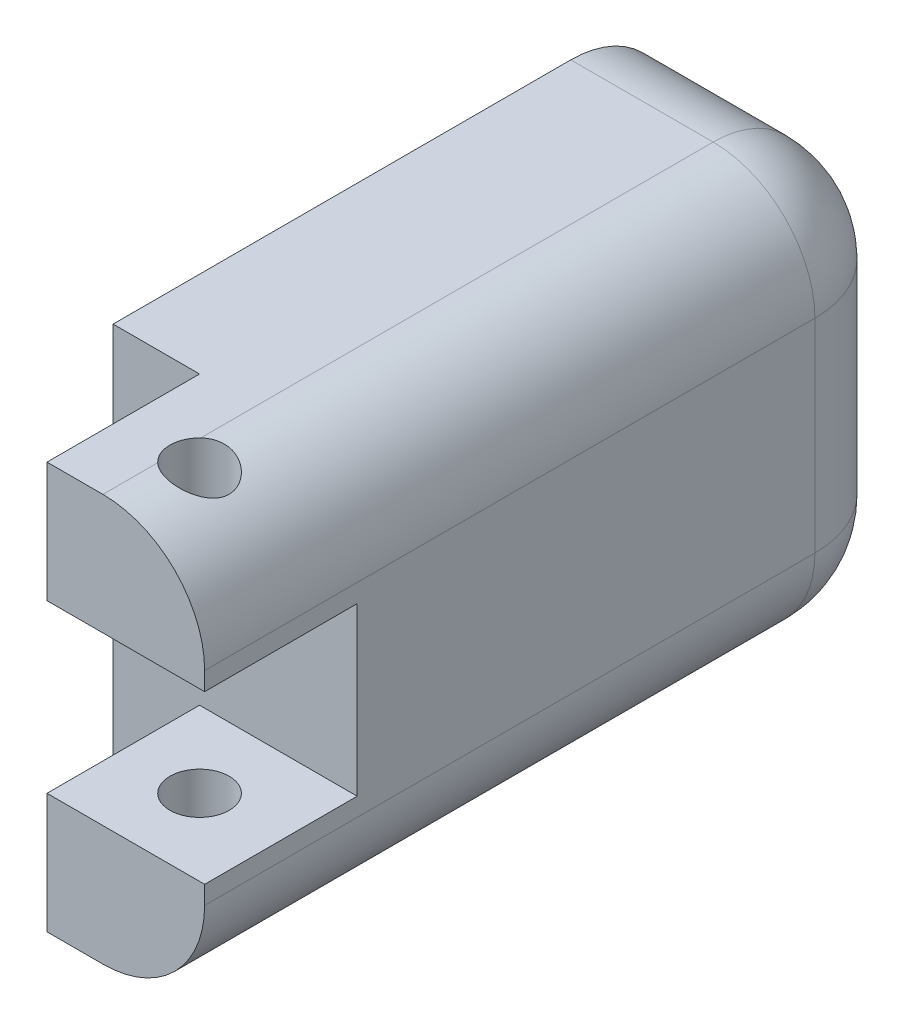
ISO-10303-21;
HEADER;
FILE_DESCRIPTION(('STEP AP214'),'2;1');
FILE_NAME('part.step','',(''),(''),'','','');
FILE_SCHEMA(('AUTOMOTIVE_DESIGN { 1 0 10303 214 1 1 1 1 }'));
ENDSEC;
DATA;
#1=APPLICATION_CONTEXT('core data for automotive mechanical design processes');
#2=APPLICATION_PROTOCOL_DEFINITION('international standard','automotive_design',2000,#1);
#3=PRODUCT_CONTEXT('',#1,'mechanical');
#4=PRODUCT('Part','Part','',(#3));
#5=PRODUCT_RELATED_PRODUCT_CATEGORY('part','',(#4));
#6=PRODUCT_DEFINITION_FORMATION('','',#4);
#7=PRODUCT_DEFINITION_CONTEXT('part definition',#1,'design');
#8=PRODUCT_DEFINITION('design','',#6,#7);
#9=PRODUCT_DEFINITION_SHAPE('','',#8);
#10=(LENGTH_UNIT() NAMED_UNIT(*) SI_UNIT(.MILLI.,.METRE.));
#11=(NAMED_UNIT(*) PLANE_ANGLE_UNIT() SI_UNIT($,.RADIAN.));
#12=(NAMED_UNIT(*) SI_UNIT($,.STERADIAN.) SOLID_ANGLE_UNIT());
#13=UNCERTAINTY_MEASURE_WITH_UNIT(LENGTH_MEASURE(1.E-05),#10,'distance_accuracy_value','');
#14=(GEOMETRIC_REPRESENTATION_CONTEXT(3) GLOBAL_UNCERTAINTY_ASSIGNED_CONTEXT((#13)) GLOBAL_UNIT_ASSIGNED_CONTEXT((#10,
#11,#12)) REPRESENTATION_CONTEXT('',''));
#15=CARTESIAN_POINT('',(0.,0.,0.));
#16=DIRECTION('',(0.,0.,1.));
#17=DIRECTION('',(1.,0.,0.));
#18=AXIS2_PLACEMENT_3D('',#15,#16,#17);
#19=CARTESIAN_POINT('',(-25.,20.,7.5));
#20=DIRECTION('',(0.,0.,-1.));
#21=DIRECTION('',(-1.,0.,0.));
#22=AXIS2_PLACEMENT_3D('',#19,#20,#21);
#23=PLANE('',#22);
#24=DIRECTION('',(0.,-1.,0.));
#25=VECTOR('',#24,1.);
#26=CARTESIAN_POINT('',(25.,20.,7.5));
#27=LINE('',#26,#25);
#28=CARTESIAN_POINT('',(25.,5.9,7.5));
#29=VERTEX_POINT('',#28);
#30=CARTESIAN_POINT('',(25.,5.,7.5));
#31=VERTEX_POINT('',#30);
#32=EDGE_CURVE('E220',#29,#31,#27,.T.);
#33=ORIENTED_EDGE('',*,*,#32,.F.);
#34=DIRECTION('',(-1.,0.,0.));
#35=VECTOR('',#34,1.);
#36=CARTESIAN_POINT('',(25.,5.9,7.5));
#37=LINE('',#36,#35);
#38=CARTESIAN_POINT('',(17.25,5.9,7.5));
#39=VERTEX_POINT('',#38);
#40=EDGE_CURVE('E301',#29,#39,#37,.T.);
#41=ORIENTED_EDGE('',*,*,#40,.T.);
#42=DIRECTION('',(0.,-1.,0.));
#43=VECTOR('',#42,1.);
#44=CARTESIAN_POINT('',(17.25,20.,7.5));
#45=LINE('',#44,#43);
#46=CARTESIAN_POINT('',(17.25,0.,7.5));
#47=VERTEX_POINT('',#46);
#48=EDGE_CURVE('E290',#39,#47,#45,.T.);
#49=ORIENTED_EDGE('',*,*,#48,.T.);
#50=DIRECTION('',(1.,0.,0.));
#51=VECTOR('',#50,1.);
#52=CARTESIAN_POINT('',(-25.,0.,7.5));
#53=LINE('',#52,#51);
#54=CARTESIAN_POINT('',(20.,0.,7.5));
#55=VERTEX_POINT('',#54);
#56=EDGE_CURVE('E205',#47,#55,#53,.T.);
#57=ORIENTED_EDGE('',*,*,#56,.T.);
#58=CARTESIAN_POINT('',(20.,5.,7.5));
#59=DIRECTION('',(0.,0.,-1.));
#60=DIRECTION('',(-1.,0.,0.));
#61=AXIS2_PLACEMENT_3D('',#58,#59,#60);
#62=CIRCLE('',#61,5.);
#63=EDGE_CURVE('E11',#55,#31,#62,.F.);
#64=ORIENTED_EDGE('',*,*,#63,.T.);
#65=EDGE_LOOP('',(#33,#41,#49,#57,#64));
#66=FACE_BOUND('',#65,.T.);
#67=ADVANCED_FACE('F41',(#66),#23,.F.);
#68=CARTESIAN_POINT('',(17.25,20.,0.));
#69=DIRECTION('',(1.,0.,0.));
#70=DIRECTION('',(0.,0.,-1.));
#71=AXIS2_PLACEMENT_3D('',#68,#69,#70);
#72=PLANE('',#71);
#73=ORIENTED_EDGE('',*,*,#48,.F.);
#74=DIRECTION('',(0.,0.,1.));
#75=VECTOR('',#74,1.);
#76=CARTESIAN_POINT('',(17.25,5.9,7.5));
#77=LINE('',#76,#75);
#78=CARTESIAN_POINT('',(17.25,5.9,0.));
#79=VERTEX_POINT('',#78);
#80=EDGE_CURVE('E316',#79,#39,#77,.T.);
#81=ORIENTED_EDGE('',*,*,#80,.F.);
#82=DIRECTION('',(0.,-1.,0.));
#83=VECTOR('',#82,1.);
#84=CARTESIAN_POINT('',(17.25,20.,0.));
#85=LINE('',#84,#83);
#86=CARTESIAN_POINT('',(17.25,0.,0.));
#87=VERTEX_POINT('',#86);
#88=EDGE_CURVE('E291',#79,#87,#85,.T.);
#89=ORIENTED_EDGE('',*,*,#88,.T.);
#90=DIRECTION('',(0.,0.,1.));
#91=VECTOR('',#90,1.);
#92=CARTESIAN_POINT('',(17.25,0.,0.));
#93=LINE('',#92,#91);
#94=EDGE_CURVE('E294',#87,#47,#93,.T.);
#95=ORIENTED_EDGE('',*,*,#94,.T.);
#96=EDGE_LOOP('',(#73,#81,#89,#95));
#97=FACE_BOUND('',#96,.T.);
#98=ADVANCED_FACE('F358',(#97),#72,.F.);
#99=CARTESIAN_POINT('',(13.,20.,-27.5));
#100=DIRECTION('',(0.,0.,1.));
#101=DIRECTION('',(1.,0.,0.));
#102=AXIS2_PLACEMENT_3D('',#99,#100,#101);
#103=PLANE('',#102);
#104=DIRECTION('',(0.,-1.,0.));
#105=VECTOR('',#104,1.);
#106=CARTESIAN_POINT('',(13.,20.,-27.5));
#107=LINE('',#106,#105);
#108=CARTESIAN_POINT('',(13.,15.,-27.5));
#109=VERTEX_POINT('',#108);
#110=CARTESIAN_POINT('',(13.,5.,-27.5));
#111=VERTEX_POINT('',#110);
#112=EDGE_CURVE('E222',#109,#111,#107,.T.);
#113=ORIENTED_EDGE('',*,*,#112,.F.);
#114=DIRECTION('',(-1.,0.,0.));
#115=VECTOR('',#114,1.);
#116=CARTESIAN_POINT('',(25.,15.,-27.5));
#117=LINE('',#116,#115);
#118=CARTESIAN_POINT('',(20.,15.,-27.5));
#119=VERTEX_POINT('',#118);
#120=EDGE_CURVE('E240',#109,#119,#117,.F.);
#121=ORIENTED_EDGE('',*,*,#120,.T.);
#122=DIRECTION('',(0.,-1.,0.));
#123=VECTOR('',#122,1.);
#124=CARTESIAN_POINT('',(20.,20.,-27.5));
#125=LINE('',#124,#123);
#126=CARTESIAN_POINT('',(20.,5.,-27.5));
#127=VERTEX_POINT('',#126);
#128=EDGE_CURVE('E238',#119,#127,#125,.T.);
#129=ORIENTED_EDGE('',*,*,#128,.T.);
#130=DIRECTION('',(-1.,0.,0.));
#131=VECTOR('',#130,1.);
#132=CARTESIAN_POINT('',(13.,5.,-27.5));
#133=LINE('',#132,#131);
#134=EDGE_CURVE('E236',#127,#111,#133,.T.);
#135=ORIENTED_EDGE('',*,*,#134,.T.);
#136=EDGE_LOOP('',(#113,#121,#129,#135));
#137=FACE_BOUND('',#136,.T.);
#138=ADVANCED_FACE('F389',(#137),#103,.F.);
#139=CARTESIAN_POINT('',(13.,20.,0.));
#140=DIRECTION('',(1.,0.,0.));
#141=DIRECTION('',(0.,0.,-1.));
#142=AXIS2_PLACEMENT_3D('',#139,#140,#141);
#143=PLANE('',#142);
#144=CARTESIAN_POINT('',(13.,10.,-17.5));
#145=DIRECTION('',(-1.,0.,0.));
#146=DIRECTION('',(0.,0.,1.));
#147=AXIS2_PLACEMENT_3D('',#144,#145,#146);
#148=CIRCLE('',#147,8.);
#149=CARTESIAN_POINT('',(13.,10.,-9.5));
#150=VERTEX_POINT('',#149);
#151=EDGE_CURVE('E275',#150,#150,#148,.T.);
#152=ORIENTED_EDGE('',*,*,#151,.F.);
#153=EDGE_LOOP('',(#152));
#154=FACE_BOUND('',#153,.T.);
#155=DIRECTION('',(0.,0.,1.));
#156=VECTOR('',#155,1.);
#157=CARTESIAN_POINT('',(13.,20.,0.));
#158=LINE('',#157,#156);
#159=CARTESIAN_POINT('',(13.,20.,-22.5));
#160=VERTEX_POINT('',#159);
#161=CARTESIAN_POINT('',(13.,20.,0.));
#162=VERTEX_POINT('',#161);
#163=EDGE_CURVE('E210',#160,#162,#158,.T.);
#164=ORIENTED_EDGE('',*,*,#163,.F.);
#165=CARTESIAN_POINT('',(13.,15.,-22.5));
#166=DIRECTION('',(1.,0.,0.));
#167=DIRECTION('',(0.,0.,-1.));
#168=AXIS2_PLACEMENT_3D('',#165,#166,#167);
#169=CIRCLE('',#168,5.);
#170=EDGE_CURVE('E234',#160,#109,#169,.F.);
#171=ORIENTED_EDGE('',*,*,#170,.T.);
#172=ORIENTED_EDGE('',*,*,#112,.T.);
#173=CARTESIAN_POINT('',(13.,5.,-22.5));
#174=DIRECTION('',(1.,0.,0.));
#175=DIRECTION('',(0.,0.,-1.));
#176=AXIS2_PLACEMENT_3D('',#173,#174,#175);
#177=CIRCLE('',#176,5.);
#178=CARTESIAN_POINT('',(13.,0.,-22.5));
#179=VERTEX_POINT('',#178);
#180=EDGE_CURVE('E232',#111,#179,#177,.F.);
#181=ORIENTED_EDGE('',*,*,#180,.T.);
#182=DIRECTION('',(0.,0.,1.));
#183=VECTOR('',#182,1.);
#184=CARTESIAN_POINT('',(13.,0.,0.));
#185=LINE('',#184,#183);
#186=CARTESIAN_POINT('',(13.,0.,0.));
#187=VERTEX_POINT('',#186);
#188=EDGE_CURVE('E200',#179,#187,#185,.T.);
#189=ORIENTED_EDGE('',*,*,#188,.T.);
#190=DIRECTION('',(0.,-1.,0.));
#191=VECTOR('',#190,1.);
#192=CARTESIAN_POINT('',(13.,20.,0.));
#193=LINE('',#192,#191);
#194=EDGE_CURVE('E219',#162,#187,#193,.T.);
#195=ORIENTED_EDGE('',*,*,#194,.F.);
#196=EDGE_LOOP('',(#164,#171,#172,#181,#189,#195));
#197=FACE_BOUND('',#196,.T.);
#198=ADVANCED_FACE('F272',(#154,#197),#143,.F.);
#199=CARTESIAN_POINT('',(17.25,20.,7.5));
#200=VERTEX_POINT('',#199);
#201=CARTESIAN_POINT('',(17.25,14.1,7.5));
#202=VERTEX_POINT('',#201);
#203=EDGE_CURVE('E284',#200,#202,#45,.T.);
#204=ORIENTED_EDGE('',*,*,#203,.T.);
#205=DIRECTION('',(-1.,0.,0.));
#206=VECTOR('',#205,1.);
#207=CARTESIAN_POINT('',(25.,14.1,7.5));
#208=LINE('',#207,#206);
#209=CARTESIAN_POINT('',(25.,14.1,7.5));
#210=VERTEX_POINT('',#209);
#211=EDGE_CURVE('E306',#210,#202,#208,.T.);
#212=ORIENTED_EDGE('',*,*,#211,.F.);
#213=CARTESIAN_POINT('',(25.,15.,7.5));
#214=VERTEX_POINT('',#213);
#215=EDGE_CURVE('E216',#214,#210,#27,.T.);
#216=ORIENTED_EDGE('',*,*,#215,.F.);
#217=CARTESIAN_POINT('',(20.,15.,7.5));
#218=DIRECTION('',(0.,0.,-1.));
#219=DIRECTION('',(-1.,0.,0.));
#220=AXIS2_PLACEMENT_3D('',#217,#218,#219);
#221=CIRCLE('',#220,5.);
#222=CARTESIAN_POINT('',(20.,20.,7.5));
#223=VERTEX_POINT('',#222);
#224=EDGE_CURVE('E50',#214,#223,#221,.F.);
#225=ORIENTED_EDGE('',*,*,#224,.T.);
#226=DIRECTION('',(1.,0.,0.));
#227=VECTOR('',#226,1.);
#228=CARTESIAN_POINT('',(-25.,20.,7.5));
#229=LINE('',#228,#227);
#230=EDGE_CURVE('E213',#200,#223,#229,.T.);
#231=ORIENTED_EDGE('',*,*,#230,.F.);
#232=EDGE_LOOP('',(#204,#212,#216,#225,#231));
#233=FACE_BOUND('',#232,.T.);
#234=ADVANCED_FACE('F383',(#233),#23,.F.);
#235=CARTESIAN_POINT('',(25.,20.,7.5));
#236=DIRECTION('',(-1.,0.,0.));
#237=DIRECTION('',(0.,0.,1.));
#238=AXIS2_PLACEMENT_3D('',#235,#236,#237);
#239=PLANE('',#238);
#240=DIRECTION('',(0.,-1.,0.));
#241=VECTOR('',#240,1.);
#242=CARTESIAN_POINT('',(25.,14.1,0.));
#243=LINE('',#242,#241);
#244=CARTESIAN_POINT('',(25.,14.1,0.));
#245=VERTEX_POINT('',#244);
#246=CARTESIAN_POINT('',(25.,5.9,0.));
#247=VERTEX_POINT('',#246);
#248=EDGE_CURVE('E322',#245,#247,#243,.T.);
#249=ORIENTED_EDGE('',*,*,#248,.T.);
#250=DIRECTION('',(0.,0.,1.));
#251=VECTOR('',#250,1.);
#252=CARTESIAN_POINT('',(25.,5.9,7.5));
#253=LINE('',#252,#251);
#254=EDGE_CURVE('E309',#247,#29,#253,.T.);
#255=ORIENTED_EDGE('',*,*,#254,.T.);
#256=ORIENTED_EDGE('',*,*,#32,.T.);
#257=DIRECTION('',(0.,0.,-1.));
#258=VECTOR('',#257,1.);
#259=CARTESIAN_POINT('',(25.,5.,7.5));
#260=LINE('',#259,#258);
#261=CARTESIAN_POINT('',(25.,5.,-22.5));
#262=VERTEX_POINT('',#261);
#263=EDGE_CURVE('E173',#31,#262,#260,.T.);
#264=ORIENTED_EDGE('',*,*,#263,.T.);
#265=DIRECTION('',(0.,-1.,0.));
#266=VECTOR('',#265,1.);
#267=CARTESIAN_POINT('',(25.,20.,-22.5));
#268=LINE('',#267,#266);
#269=CARTESIAN_POINT('',(25.,15.,-22.5));
#270=VERTEX_POINT('',#269);
#271=EDGE_CURVE('E176',#262,#270,#268,.F.);
#272=ORIENTED_EDGE('',*,*,#271,.T.);
#273=DIRECTION('',(0.,0.,-1.));
#274=VECTOR('',#273,1.);
#275=CARTESIAN_POINT('',(25.,15.,7.5));
#276=LINE('',#275,#274);
#277=EDGE_CURVE('E242',#270,#214,#276,.F.);
#278=ORIENTED_EDGE('',*,*,#277,.T.);
#279=ORIENTED_EDGE('',*,*,#215,.T.);
#280=DIRECTION('',(0.,0.,-1.));
#281=VECTOR('',#280,1.);
#282=CARTESIAN_POINT('',(25.,14.1,7.5));
#283=LINE('',#282,#281);
#284=EDGE_CURVE('E318',#210,#245,#283,.T.);
#285=ORIENTED_EDGE('',*,*,#284,.T.);
#286=EDGE_LOOP('',(#249,#255,#256,#264,#272,#278,#279,#285));
#287=FACE_BOUND('',#286,.T.);
#288=ADVANCED_FACE('F247',(#287),#239,.F.);
#289=CARTESIAN_POINT('',(0.,20.,0.));
#290=DIRECTION('',(0.,1.,0.));
#291=DIRECTION('',(0.,0.,1.));
#292=AXIS2_PLACEMENT_3D('',#289,#290,#291);
#293=PLANE('',#292);
#294=CARTESIAN_POINT('',(20.9999999999933,20.,3.74999999999829));
#295=DIRECTION('',(0.,1.,0.));
#296=DIRECTION('',(0.,0.,1.));
#297=AXIS2_PLACEMENT_3D('',#294,#295,#296);
#298=CIRCLE('',#297,1.455);
#299=CARTESIAN_POINT('',(20.,20.,2.69310596556843));
#300=VERTEX_POINT('',#299);
#301=CARTESIAN_POINT('',(20.,20.,4.80689403442814));
#302=VERTEX_POINT('',#301);
#303=EDGE_CURVE('E64',#300,#302,#298,.T.);
#304=ORIENTED_EDGE('',*,*,#303,.F.);
#305=DIRECTION('',(0.,0.,-1.));
#306=VECTOR('',#305,1.);
#307=CARTESIAN_POINT('',(20.,20.,-27.5));
#308=LINE('',#307,#306);
#309=CARTESIAN_POINT('',(20.,20.,-22.5));
#310=VERTEX_POINT('',#309);
#311=EDGE_CURVE('E225',#300,#310,#308,.T.);
#312=ORIENTED_EDGE('',*,*,#311,.T.);
#313=DIRECTION('',(-1.,0.,0.));
#314=VECTOR('',#313,1.);
#315=CARTESIAN_POINT('',(13.,20.,-22.5));
#316=LINE('',#315,#314);
#317=EDGE_CURVE('E229',#310,#160,#316,.T.);
#318=ORIENTED_EDGE('',*,*,#317,.T.);
#319=ORIENTED_EDGE('',*,*,#163,.T.);
#320=DIRECTION('',(1.,0.,0.));
#321=VECTOR('',#320,1.);
#322=CARTESIAN_POINT('',(13.,20.,0.));
#323=LINE('',#322,#321);
#324=CARTESIAN_POINT('',(17.25,20.,0.));
#325=VERTEX_POINT('',#324);
#326=EDGE_CURVE('E297',#162,#325,#323,.T.);
#327=ORIENTED_EDGE('',*,*,#326,.T.);
#328=DIRECTION('',(0.,0.,1.));
#329=VECTOR('',#328,1.);
#330=CARTESIAN_POINT('',(17.25,20.,0.));
#331=LINE('',#330,#329);
#332=EDGE_CURVE('E302',#325,#200,#331,.T.);
#333=ORIENTED_EDGE('',*,*,#332,.T.);
#334=ORIENTED_EDGE('',*,*,#230,.T.);
#335=EDGE_CURVE('E226',#223,#302,#308,.T.);
#336=ORIENTED_EDGE('',*,*,#335,.T.);
#337=EDGE_LOOP('',(#304,#312,#318,#319,#327,#333,#334,#336));
#338=FACE_BOUND('',#337,.T.);
#339=ADVANCED_FACE('F270',(#338),#293,.T.);
#340=CARTESIAN_POINT('',(0.,0.,0.));
#341=DIRECTION('',(0.,1.,0.));
#342=DIRECTION('',(0.,0.,1.));
#343=AXIS2_PLACEMENT_3D('',#340,#341,#342);
#344=PLANE('',#343);
#345=DIRECTION('',(0.,0.,-1.));
#346=VECTOR('',#345,1.);
#347=CARTESIAN_POINT('',(20.,0.,0.));
#348=LINE('',#347,#346);
#349=CARTESIAN_POINT('',(20.,0.,-22.5));
#350=VERTEX_POINT('',#349);
#351=CARTESIAN_POINT('',(20.,0.,2.69310596556844));
#352=VERTEX_POINT('',#351);
#353=EDGE_CURVE('E168',#350,#352,#348,.F.);
#354=ORIENTED_EDGE('',*,*,#353,.T.);
#355=CARTESIAN_POINT('',(20.9999999999933,0.,3.7499999999983));
#356=DIRECTION('',(0.,1.,0.));
#357=DIRECTION('',(0.,0.,1.));
#358=AXIS2_PLACEMENT_3D('',#355,#356,#357);
#359=CIRCLE('',#358,1.455);
#360=CARTESIAN_POINT('',(20.,0.,4.80689403442815));
#361=VERTEX_POINT('',#360);
#362=EDGE_CURVE('E57',#352,#361,#359,.T.);
#363=ORIENTED_EDGE('',*,*,#362,.T.);
#364=EDGE_CURVE('E166',#361,#55,#348,.F.);
#365=ORIENTED_EDGE('',*,*,#364,.T.);
#366=ORIENTED_EDGE('',*,*,#56,.F.);
#367=ORIENTED_EDGE('',*,*,#94,.F.);
#368=DIRECTION('',(1.,0.,0.));
#369=VECTOR('',#368,1.);
#370=CARTESIAN_POINT('',(13.,0.,0.));
#371=LINE('',#370,#369);
#372=EDGE_CURVE('E298',#187,#87,#371,.T.);
#373=ORIENTED_EDGE('',*,*,#372,.F.);
#374=ORIENTED_EDGE('',*,*,#188,.F.);
#375=DIRECTION('',(-1.,0.,0.));
#376=VECTOR('',#375,1.);
#377=CARTESIAN_POINT('',(0.,0.,-22.5));
#378=LINE('',#377,#376);
#379=EDGE_CURVE('E175',#179,#350,#378,.F.);
#380=ORIENTED_EDGE('',*,*,#379,.T.);
#381=EDGE_LOOP('',(#354,#363,#365,#366,#367,#373,#374,#380));
#382=FACE_BOUND('',#381,.T.);
#383=ADVANCED_FACE('F164',(#382),#344,.F.);
#384=CARTESIAN_POINT('',(13.,5.,-22.5));
#385=DIRECTION('',(-1.,0.,0.));
#386=DIRECTION('',(0.,0.,1.));
#387=AXIS2_PLACEMENT_3D('',#384,#385,#386);
#388=CYLINDRICAL_SURFACE('',#387,5.);
#389=ORIENTED_EDGE('',*,*,#180,.F.);
#390=ORIENTED_EDGE('',*,*,#134,.F.);
#391=CARTESIAN_POINT('',(20.,5.,-22.5));
#392=DIRECTION('',(1.,0.,0.));
#393=DIRECTION('',(0.,0.,-1.));
#394=AXIS2_PLACEMENT_3D('',#391,#392,#393);
#395=CIRCLE('',#394,5.);
#396=EDGE_CURVE('E198',#350,#127,#395,.T.);
#397=ORIENTED_EDGE('',*,*,#396,.F.);
#398=ORIENTED_EDGE('',*,*,#379,.F.);
#399=EDGE_LOOP('',(#389,#390,#397,#398));
#400=FACE_BOUND('',#399,.T.);
#401=ADVANCED_FACE('F43',(#400),#388,.T.);
#402=CARTESIAN_POINT('',(20.,5.,7.5));
#403=DIRECTION('',(0.,0.,-1.));
#404=DIRECTION('',(-1.,0.,0.));
#405=AXIS2_PLACEMENT_3D('',#402,#403,#404);
#406=CYLINDRICAL_SURFACE('',#405,5.);
#407=CARTESIAN_POINT('',(20.,0.,2.69310596556844));
#408=CARTESIAN_POINT('',(20.0289991323792,-7.29632451473138E-08,2.66566796652922));
#409=CARTESIAN_POINT('',(20.0591154034861,0.000252665012934149,2.63943641316296));
#410=CARTESIAN_POINT('',(20.1213940751633,0.00137665121071527,2.58953865457813));
#411=CARTESIAN_POINT('',(20.1535565692954,0.0022479277330027,2.56587256679729));
#412=CARTESIAN_POINT('',(20.2527181006767,0.00595481563961647,2.4990282220594));
#413=CARTESIAN_POINT('',(20.3224878768861,0.00988274610659853,2.45991259209277));
#414=CARTESIAN_POINT('',(20.4672812760763,0.0213528023261813,2.39368582842148));
#415=CARTESIAN_POINT('',(20.542310129043,0.0288985707223543,2.36658684680663));
#416=CARTESIAN_POINT('',(20.6952803434361,0.0479784406507556,2.32506279790163));
#417=CARTESIAN_POINT('',(20.7732204348038,0.0595108206957367,2.31063226966076));
#418=CARTESIAN_POINT('',(20.9293038327284,0.0864843453003644,2.29461241750548));
#419=CARTESIAN_POINT('',(21.0074440093867,0.101904989177951,2.29295714030917));
#420=CARTESIAN_POINT('',(21.1622227618551,0.13630490314544,2.30199325767649));
#421=CARTESIAN_POINT('',(21.2388606987018,0.155285652708732,2.31268979484858));
#422=CARTESIAN_POINT('',(21.3914692007022,0.196845536735504,2.34639626435031));
#423=CARTESIAN_POINT('',(21.4673152585283,0.219530030627234,2.36983777412526));
#424=CARTESIAN_POINT('',(21.6136724284583,0.266926209171585,2.42839139481723));
#425=CARTESIAN_POINT('',(21.6841822075612,0.291638397149535,2.46350641003667));
#426=CARTESIAN_POINT('',(21.8228783661313,0.343504514158111,2.54713722531181));
#427=CARTESIAN_POINT('',(21.8906047545327,0.370711986605197,2.59638414376172));
#428=CARTESIAN_POINT('',(22.0168560501967,0.424302947128886,2.7059595404718));
#429=CARTESIAN_POINT('',(22.0753762991783,0.450686012681912,2.76629359553085));
#430=CARTESIAN_POINT('',(22.1829294167356,0.501284664926783,2.89845182700752));
#431=CARTESIAN_POINT('',(22.2316967491626,0.525431880632514,2.97051988999082));
#432=CARTESIAN_POINT('',(22.3160597578162,0.568507782103811,3.12340870165797));
#433=CARTESIAN_POINT('',(22.3516660519681,0.587440671471836,3.20422232633489));
#434=CARTESIAN_POINT('',(22.4055817511651,0.616617150424555,3.36532728161525));
#435=CARTESIAN_POINT('',(22.4250742412312,0.627447983655841,3.44511341470294));
#436=CARTESIAN_POINT('',(22.4503227243004,0.641543804031139,3.60745801985377));
#437=CARTESIAN_POINT('',(22.4560919787498,0.644816095282273,3.69001373720982));
#438=CARTESIAN_POINT('',(22.4537071359573,0.643474799268953,3.84540439197736));
#439=CARTESIAN_POINT('',(22.4470636207468,0.639716711157539,3.91827583192347));
#440=CARTESIAN_POINT('',(22.4230839758415,0.626345894002301,4.06167497158152));
#441=CARTESIAN_POINT('',(22.4057469455056,0.616732671821665,4.13220247335232));
#442=CARTESIAN_POINT('',(22.3612195399153,0.592588709463913,4.26890600259043));
#443=CARTESIAN_POINT('',(22.3340587781073,0.578072757084958,4.33509440923933));
#444=CARTESIAN_POINT('',(22.2708416062118,0.545278525699259,4.46205399818155));
#445=CARTESIAN_POINT('',(22.2347821588716,0.526998962470269,4.52282332120067));
#446=CARTESIAN_POINT('',(22.1505581451953,0.48585405429064,4.64400156159153));
#447=CARTESIAN_POINT('',(22.101522568413,0.46270914545896,4.70370976128877));
#448=CARTESIAN_POINT('',(21.9950214364903,0.414882881994264,4.81435942516377));
#449=CARTESIAN_POINT('',(21.9375515839113,0.390200747825401,4.86529639128961));
#450=CARTESIAN_POINT('',(21.8091989818751,0.338235078888419,4.96215304426392));
#451=CARTESIAN_POINT('',(21.737548724478,0.310939363210863,5.00705425041036));
#452=CARTESIAN_POINT('',(21.5870810604496,0.257897570020583,5.08397950727311));
#453=CARTESIAN_POINT('',(21.5082619107629,0.232151871923997,5.11600041593658));
#454=CARTESIAN_POINT('',(21.3446843846207,0.183449461156311,5.16618991849463));
#455=CARTESIAN_POINT('',(21.25988127019,0.160518279380845,5.18423861308462));
#456=CARTESIAN_POINT('',(21.0874388376844,0.118880487520612,5.20496002287037));
#457=CARTESIAN_POINT('',(20.9998018654339,0.100170480633288,5.20764514391556));
#458=CARTESIAN_POINT('',(20.8300871476489,0.0686781774366594,5.19738373300875));
#459=CARTESIAN_POINT('',(20.748006188003,0.0555972270695557,5.18540906214148));
#460=CARTESIAN_POINT('',(20.5865078951675,0.0338491968278808,5.1474743629457));
#461=CARTESIAN_POINT('',(20.5070914220113,0.0251835295394954,5.1215098642962));
#462=CARTESIAN_POINT('',(20.3512391287942,0.0117208736975405,5.05518519649551));
#463=CARTESIAN_POINT('',(20.2749654243907,0.00704843565051562,5.0144145050743));
#464=CARTESIAN_POINT('',(20.1668160832949,0.00265150448205993,4.94360898437488));
#465=CARTESIAN_POINT('',(20.1317675851323,0.0016215230446247,4.9183590283088));
#466=CARTESIAN_POINT('',(20.0640442314956,0.000295773926668113,4.8648415759743));
#467=CARTESIAN_POINT('',(20.0313692028875,-4.73599015406764E-08,4.83657430017821));
#468=CARTESIAN_POINT('',(20.,0.,4.80689403442815));
#469=B_SPLINE_CURVE_WITH_KNOTS('',3,(#407,#408,#409,#410,#411,#412,#413,#414,#415,#416,#417,
#418,#419,#420,#421,#422,#423,#424,#425,#426,#427,#428,#429,#430,#431,#432,#433,#434,#435,#436,
#437,#438,#439,#440,#441,#442,#443,#444,#445,#446,#447,#448,#449,#450,#451,#452,#453,#454,#455,
#456,#457,#458,#459,#460,#461,#462,#463,#464,#465,#466,#467,#468),.UNSPECIFIED.,.F.,.F.,(4,2,2,
2,2,2,2,2,2,2,2,2,2,2,2,2,2,2,2,2,2,2,2,2,2,2,2,2,2,2,4),(0.,0.119696370359028,
0.239398217672901,0.478408006868786,0.717658951605441,0.956806712470092,1.19471902213633,
1.4327304209796,1.67935473251959,1.92604044877751,2.18899694387248,2.45208606920604,
2.72157758592075,2.99085120805882,3.23794658864791,3.4848030914817,3.70355129136044,
3.92231791741154,4.14043049825779,4.35861762736053,4.59959593949575,4.84069746413337,
5.1060260259267,5.371419273455,5.63906543463653,5.90649544512446,6.15711716032144,
6.40781900692089,6.66608137285183,6.79555599616039,6.92502116536398),.UNSPECIFIED.);
#470=EDGE_CURVE('E153',#352,#361,#469,.T.);
#471=ORIENTED_EDGE('',*,*,#470,.F.);
#472=ORIENTED_EDGE('',*,*,#353,.F.);
#473=CARTESIAN_POINT('',(20.,5.,-22.5));
#474=DIRECTION('',(0.,0.,-1.));
#475=DIRECTION('',(-1.,0.,0.));
#476=AXIS2_PLACEMENT_3D('',#473,#474,#475);
#477=CIRCLE('',#476,5.);
#478=EDGE_CURVE('E196',#262,#350,#477,.T.);
#479=ORIENTED_EDGE('',*,*,#478,.F.);
#480=ORIENTED_EDGE('',*,*,#263,.F.);
#481=ORIENTED_EDGE('',*,*,#63,.F.);
#482=ORIENTED_EDGE('',*,*,#364,.F.);
#483=EDGE_LOOP('',(#471,#472,#479,#480,#481,#482));
#484=FACE_BOUND('',#483,.T.);
#485=ADVANCED_FACE('F171',(#484),#406,.T.);
#486=CARTESIAN_POINT('',(20.,5.,-22.5));
#487=DIRECTION('',(0.,-1.,0.));
#488=DIRECTION('',(0.,0.,-1.));
#489=AXIS2_PLACEMENT_3D('',#486,#487,#488);
#490=SPHERICAL_SURFACE('',#489,5.);
#491=ORIENTED_EDGE('',*,*,#478,.T.);
#492=ORIENTED_EDGE('',*,*,#396,.T.);
#493=CARTESIAN_POINT('',(20.,5.,-22.5));
#494=DIRECTION('',(0.,-1.,0.));
#495=DIRECTION('',(0.,0.,-1.));
#496=AXIS2_PLACEMENT_3D('',#493,#494,#495);
#497=CIRCLE('',#496,5.);
#498=EDGE_CURVE('E193',#262,#127,#497,.F.);
#499=ORIENTED_EDGE('',*,*,#498,.F.);
#500=EDGE_LOOP('',(#491,#492,#499));
#501=FACE_BOUND('',#500,.T.);
#502=ADVANCED_FACE('F401',(#501),#490,.T.);
#503=CARTESIAN_POINT('',(20.,20.,-22.5));
#504=DIRECTION('',(0.,-1.,0.));
#505=DIRECTION('',(0.,0.,-1.));
#506=AXIS2_PLACEMENT_3D('',#503,#504,#505);
#507=CYLINDRICAL_SURFACE('',#506,5.);
#508=ORIENTED_EDGE('',*,*,#498,.T.);
#509=ORIENTED_EDGE('',*,*,#128,.F.);
#510=CARTESIAN_POINT('',(20.,15.,-22.5));
#511=DIRECTION('',(0.,1.,0.));
#512=DIRECTION('',(0.,0.,1.));
#513=AXIS2_PLACEMENT_3D('',#510,#511,#512);
#514=CIRCLE('',#513,5.);
#515=EDGE_CURVE('E190',#270,#119,#514,.T.);
#516=ORIENTED_EDGE('',*,*,#515,.F.);
#517=ORIENTED_EDGE('',*,*,#271,.F.);
#518=EDGE_LOOP('',(#508,#509,#516,#517));
#519=FACE_BOUND('',#518,.T.);
#520=ADVANCED_FACE('F260',(#519),#507,.T.);
#521=CARTESIAN_POINT('',(20.,15.,0.));
#522=DIRECTION('',(0.,0.,1.));
#523=DIRECTION('',(1.,0.,0.));
#524=AXIS2_PLACEMENT_3D('',#521,#522,#523);
#525=CYLINDRICAL_SURFACE('',#524,5.);
#526=CARTESIAN_POINT('',(20.,20.,4.80689403442815));
#527=CARTESIAN_POINT('',(20.0289991323792,20.0000000729632,4.83433203346737));
#528=CARTESIAN_POINT('',(20.0591154034861,19.9997473349871,4.86056358683363));
#529=CARTESIAN_POINT('',(20.1213940751633,19.9986233487893,4.91046134541845));
#530=CARTESIAN_POINT('',(20.1535565692954,19.997752072267,4.93412743319929));
#531=CARTESIAN_POINT('',(20.2527181006767,19.9940451843604,5.00097177793719));
#532=CARTESIAN_POINT('',(20.3224878768861,19.9901172538934,5.04008740790382));
#533=CARTESIAN_POINT('',(20.4672812760763,19.9786471976738,5.10631417157511));
#534=CARTESIAN_POINT('',(20.542310129043,19.9711014292776,5.13341315318995));
#535=CARTESIAN_POINT('',(20.6952803434361,19.9520215593492,5.17493720209495));
#536=CARTESIAN_POINT('',(20.7732204348038,19.9404891793043,5.18936773033583));
#537=CARTESIAN_POINT('',(20.9293038327284,19.9135156546996,5.20538758249111));
#538=CARTESIAN_POINT('',(21.0074440093867,19.898095010822,5.20704285968741));
#539=CARTESIAN_POINT('',(21.1622227618551,19.8636950968546,5.19800674232009));
#540=CARTESIAN_POINT('',(21.2388606987018,19.8447143472913,5.18731020514801));
#541=CARTESIAN_POINT('',(21.3914692007022,19.8031544632645,5.15360373564627));
#542=CARTESIAN_POINT('',(21.4673152585283,19.7804699693728,5.13016222587132));
#543=CARTESIAN_POINT('',(21.6136724284583,19.7330737908284,5.07160860517935));
#544=CARTESIAN_POINT('',(21.6841822075612,19.7083616028505,5.03649358995992));
#545=CARTESIAN_POINT('',(21.8228783661313,19.6564954858419,4.95286277468478));
#546=CARTESIAN_POINT('',(21.8906047545327,19.6292880133948,4.90361585623486));
#547=CARTESIAN_POINT('',(22.0168560501967,19.5756970528711,4.79404045952479));
#548=CARTESIAN_POINT('',(22.0753762991783,19.5493139873181,4.73370640446573));
#549=CARTESIAN_POINT('',(22.1829294167356,19.4987153350732,4.60154817298906));
#550=CARTESIAN_POINT('',(22.2316967491626,19.4745681193675,4.52948011000577));
#551=CARTESIAN_POINT('',(22.3160597578162,19.4314922178962,4.37659129833861));
#552=CARTESIAN_POINT('',(22.3516660519681,19.4125593285282,4.2957776736617));
#553=CARTESIAN_POINT('',(22.4055817511651,19.3833828495754,4.13467271838133));
#554=CARTESIAN_POINT('',(22.4250742412312,19.3725520163442,4.05488658529364));
#555=CARTESIAN_POINT('',(22.4503227243004,19.3584561959689,3.89254198014281));
#556=CARTESIAN_POINT('',(22.4560919787498,19.3551839047177,3.80998626278676));
#557=CARTESIAN_POINT('',(22.4537071359573,19.356525200731,3.65459560801922));
#558=CARTESIAN_POINT('',(22.4470636207468,19.3602832888425,3.58172416807311));
#559=CARTESIAN_POINT('',(22.4230839758415,19.3736541059977,3.43832502841506));
#560=CARTESIAN_POINT('',(22.4057469455056,19.3832673281783,3.36779752664426));
#561=CARTESIAN_POINT('',(22.3612195399153,19.4074112905361,3.23109399740615));
#562=CARTESIAN_POINT('',(22.3340587781073,19.421927242915,3.16490559075725));
#563=CARTESIAN_POINT('',(22.2708416062118,19.4547214743007,3.03794600181504));
#564=CARTESIAN_POINT('',(22.2347821588716,19.4730010375297,2.97717667879591));
#565=CARTESIAN_POINT('',(22.1505581451953,19.5141459457094,2.85599843840505));
#566=CARTESIAN_POINT('',(22.101522568413,19.537290854541,2.79629023870782));
#567=CARTESIAN_POINT('',(21.9950214364903,19.5851171180057,2.68564057483282));
#568=CARTESIAN_POINT('',(21.9375515839113,19.6097992521746,2.63470360870698));
#569=CARTESIAN_POINT('',(21.8091989818751,19.6617649211116,2.53784695573266));
#570=CARTESIAN_POINT('',(21.737548724478,19.6890606367891,2.49294574958622));
#571=CARTESIAN_POINT('',(21.5870810604495,19.7421024299794,2.41602049272348));
#572=CARTESIAN_POINT('',(21.5082619107629,19.767848128076,2.38399958406));
#573=CARTESIAN_POINT('',(21.3446843846207,19.8165505388437,2.33381008150195));
#574=CARTESIAN_POINT('',(21.25988127019,19.8394817206192,2.31576138691196));
#575=CARTESIAN_POINT('',(21.0874388376844,19.8811195124794,2.29503997712621));
#576=CARTESIAN_POINT('',(20.9998018654339,19.8998295193667,2.29235485608102));
#577=CARTESIAN_POINT('',(20.8300871476489,19.9313218225633,2.30261626698784));
#578=CARTESIAN_POINT('',(20.748006188003,19.9444027729304,2.3145909378551));
#579=CARTESIAN_POINT('',(20.5865078951675,19.9661508031721,2.35252563705089));
#580=CARTESIAN_POINT('',(20.5070914220113,19.9748164704605,2.37849013570039));
#581=CARTESIAN_POINT('',(20.3512391287942,19.9882791263025,2.44481480350107));
#582=CARTESIAN_POINT('',(20.2749654243907,19.9929515643495,2.48558549492229));
#583=CARTESIAN_POINT('',(20.1668160832949,19.9973484955179,2.55639101562171));
#584=CARTESIAN_POINT('',(20.1317675851323,19.9983784769554,2.58164097168779));
#585=CARTESIAN_POINT('',(20.0640442314956,19.9997042260733,2.63515842402229));
#586=CARTESIAN_POINT('',(20.0313692028875,20.0000000473599,2.66342569981837));
#587=CARTESIAN_POINT('',(20.,20.,2.69310596556843));
#588=B_SPLINE_CURVE_WITH_KNOTS('',3,(#526,#527,#528,#529,#530,#531,#532,#533,#534,#535,#536,
#537,#538,#539,#540,#541,#542,#543,#544,#545,#546,#547,#548,#549,#550,#551,#552,#553,#554,#555,
#556,#557,#558,#559,#560,#561,#562,#563,#564,#565,#566,#567,#568,#569,#570,#571,#572,#573,#574,
#575,#576,#577,#578,#579,#580,#581,#582,#583,#584,#585,#586,#587),.UNSPECIFIED.,.F.,.F.,(4,2,2,
2,2,2,2,2,2,2,2,2,2,2,2,2,2,2,2,2,2,2,2,2,2,2,2,2,2,2,4),(0.,0.119696370359028,
0.239398217672901,0.47840800686879,0.717658951605441,0.956806712470096,1.19471902213633,
1.4327304209796,1.6793547325196,1.92604044877752,2.18899694387249,2.45208606920604,
2.72157758592075,2.99085120805882,3.23794658864791,3.48480309148171,3.70355129136044,
3.92231791741155,4.14043049825779,4.35861762736054,4.59959593949575,4.84069746413337,
5.1060260259267,5.37141927345501,5.63906543463654,5.90649544512447,6.15711716032145,
6.40781900692089,6.66608137285183,6.79555599616039,6.92502116536398),.UNSPECIFIED.);
#589=EDGE_CURVE('E161',#302,#300,#588,.T.);
#590=ORIENTED_EDGE('',*,*,#589,.F.);
#591=ORIENTED_EDGE('',*,*,#335,.F.);
#592=ORIENTED_EDGE('',*,*,#224,.F.);
#593=ORIENTED_EDGE('',*,*,#277,.F.);
#594=CARTESIAN_POINT('',(20.,15.,-22.5));
#595=DIRECTION('',(0.,0.,-1.));
#596=DIRECTION('',(-1.,0.,0.));
#597=AXIS2_PLACEMENT_3D('',#594,#595,#596);
#598=CIRCLE('',#597,5.);
#599=EDGE_CURVE('E186',#310,#270,#598,.T.);
#600=ORIENTED_EDGE('',*,*,#599,.F.);
#601=ORIENTED_EDGE('',*,*,#311,.F.);
#602=EDGE_LOOP('',(#590,#591,#592,#593,#600,#601));
#603=FACE_BOUND('',#602,.T.);
#604=ADVANCED_FACE('F255',(#603),#525,.T.);
#605=CARTESIAN_POINT('',(20.,15.,-22.5));
#606=DIRECTION('',(1.,0.,0.));
#607=DIRECTION('',(0.,0.,-1.));
#608=AXIS2_PLACEMENT_3D('',#605,#606,#607);
#609=SPHERICAL_SURFACE('',#608,5.);
#610=ORIENTED_EDGE('',*,*,#599,.T.);
#611=ORIENTED_EDGE('',*,*,#515,.T.);
#612=CARTESIAN_POINT('',(20.,15.,-22.5));
#613=DIRECTION('',(1.,0.,0.));
#614=DIRECTION('',(0.,0.,-1.));
#615=AXIS2_PLACEMENT_3D('',#612,#613,#614);
#616=CIRCLE('',#615,5.);
#617=EDGE_CURVE('E183',#310,#119,#616,.F.);
#618=ORIENTED_EDGE('',*,*,#617,.F.);
#619=EDGE_LOOP('',(#610,#611,#618));
#620=FACE_BOUND('',#619,.T.);
#621=ADVANCED_FACE('F262',(#620),#609,.T.);
#622=CARTESIAN_POINT('',(0.,15.,-22.5));
#623=DIRECTION('',(1.,0.,0.));
#624=DIRECTION('',(0.,0.,-1.));
#625=AXIS2_PLACEMENT_3D('',#622,#623,#624);
#626=CYLINDRICAL_SURFACE('',#625,5.);
#627=ORIENTED_EDGE('',*,*,#617,.T.);
#628=ORIENTED_EDGE('',*,*,#120,.F.);
#629=ORIENTED_EDGE('',*,*,#170,.F.);
#630=ORIENTED_EDGE('',*,*,#317,.F.);
#631=EDGE_LOOP('',(#627,#628,#629,#630));
#632=FACE_BOUND('',#631,.T.);
#633=ADVANCED_FACE('F266',(#632),#626,.T.);
#634=CARTESIAN_POINT('',(18.,10.,-17.5));
#635=DIRECTION('',(-1.,0.,0.));
#636=DIRECTION('',(0.,0.,1.));
#637=AXIS2_PLACEMENT_3D('',#634,#635,#636);
#638=CYLINDRICAL_SURFACE('',#637,8.);
#639=CARTESIAN_POINT('',(18.,10.,-17.5));
#640=DIRECTION('',(-1.,0.,0.));
#641=DIRECTION('',(0.,0.,1.));
#642=AXIS2_PLACEMENT_3D('',#639,#640,#641);
#643=CIRCLE('',#642,8.);
#644=CARTESIAN_POINT('',(18.,10.,-9.5));
#645=VERTEX_POINT('',#644);
#646=EDGE_CURVE('E187',#645,#645,#643,.T.);
#647=ORIENTED_EDGE('',*,*,#646,.F.);
#648=EDGE_LOOP('',(#647));
#649=FACE_BOUND('',#648,.T.);
#650=ORIENTED_EDGE('',*,*,#151,.T.);
#651=EDGE_LOOP('',(#650));
#652=FACE_BOUND('',#651,.T.);
#653=ADVANCED_FACE('F372',(#649,#652),#638,.F.);
#654=CARTESIAN_POINT('',(18.,10.,-17.5));
#655=DIRECTION('',(-1.,0.,0.));
#656=DIRECTION('',(0.,0.,1.));
#657=AXIS2_PLACEMENT_3D('',#654,#655,#656);
#658=PLANE('',#657);
#659=CARTESIAN_POINT('',(18.,10.,-17.5));
#660=DIRECTION('',(-1.,0.,0.));
#661=DIRECTION('',(0.,0.,1.));
#662=AXIS2_PLACEMENT_3D('',#659,#660,#661);
#663=CIRCLE('',#662,6.);
#664=CARTESIAN_POINT('',(18.,10.,-11.5));
#665=VERTEX_POINT('',#664);
#666=EDGE_CURVE('E281',#665,#665,#663,.T.);
#667=ORIENTED_EDGE('',*,*,#666,.F.);
#668=EDGE_LOOP('',(#667));
#669=FACE_BOUND('',#668,.T.);
#670=ORIENTED_EDGE('',*,*,#646,.T.);
#671=EDGE_LOOP('',(#670));
#672=FACE_BOUND('',#671,.T.);
#673=ADVANCED_FACE('F368',(#669,#672),#658,.T.);
#674=CARTESIAN_POINT('',(19.,10.,-17.5));
#675=DIRECTION('',(-1.,0.,0.));
#676=DIRECTION('',(0.,0.,1.));
#677=AXIS2_PLACEMENT_3D('',#674,#675,#676);
#678=CYLINDRICAL_SURFACE('',#677,6.);
#679=CARTESIAN_POINT('',(19.,10.,-17.5));
#680=DIRECTION('',(-1.,0.,0.));
#681=DIRECTION('',(0.,0.,1.));
#682=AXIS2_PLACEMENT_3D('',#679,#680,#681);
#683=CIRCLE('',#682,6.);
#684=CARTESIAN_POINT('',(19.,10.,-11.5));
#685=VERTEX_POINT('',#684);
#686=EDGE_CURVE('E278',#685,#685,#683,.T.);
#687=ORIENTED_EDGE('',*,*,#686,.F.);
#688=EDGE_LOOP('',(#687));
#689=FACE_BOUND('',#688,.T.);
#690=ORIENTED_EDGE('',*,*,#666,.T.);
#691=EDGE_LOOP('',(#690));
#692=FACE_BOUND('',#691,.T.);
#693=ADVANCED_FACE('F364',(#689,#692),#678,.F.);
#694=CARTESIAN_POINT('',(19.,10.,-17.5));
#695=DIRECTION('',(-1.,0.,0.));
#696=DIRECTION('',(0.,0.,1.));
#697=AXIS2_PLACEMENT_3D('',#694,#695,#696);
#698=PLANE('',#697);
#699=ORIENTED_EDGE('',*,*,#686,.T.);
#700=EDGE_LOOP('',(#699));
#701=FACE_BOUND('',#700,.T.);
#702=ADVANCED_FACE('F356',(#701),#698,.T.);
#703=CARTESIAN_POINT('',(17.25,14.1,0.));
#704=VERTEX_POINT('',#703);
#705=EDGE_CURVE('E287',#325,#704,#85,.T.);
#706=ORIENTED_EDGE('',*,*,#705,.T.);
#707=DIRECTION('',(0.,0.,-1.));
#708=VECTOR('',#707,1.);
#709=CARTESIAN_POINT('',(17.25,14.1,7.5));
#710=LINE('',#709,#708);
#711=EDGE_CURVE('E160',#202,#704,#710,.T.);
#712=ORIENTED_EDGE('',*,*,#711,.F.);
#713=ORIENTED_EDGE('',*,*,#203,.F.);
#714=ORIENTED_EDGE('',*,*,#332,.F.);
#715=EDGE_LOOP('',(#706,#712,#713,#714));
#716=FACE_BOUND('',#715,.T.);
#717=ADVANCED_FACE('F353',(#716),#72,.F.);
#718=CARTESIAN_POINT('',(13.,20.,0.));
#719=DIRECTION('',(0.,0.,-1.));
#720=DIRECTION('',(-1.,0.,0.));
#721=AXIS2_PLACEMENT_3D('',#718,#719,#720);
#722=PLANE('',#721);
#723=ORIENTED_EDGE('',*,*,#372,.T.);
#724=ORIENTED_EDGE('',*,*,#88,.F.);
#725=DIRECTION('',(-1.,0.,0.));
#726=VECTOR('',#725,1.);
#727=CARTESIAN_POINT('',(25.,5.9,0.));
#728=LINE('',#727,#726);
#729=EDGE_CURVE('E312',#247,#79,#728,.T.);
#730=ORIENTED_EDGE('',*,*,#729,.F.);
#731=ORIENTED_EDGE('',*,*,#248,.F.);
#732=DIRECTION('',(-1.,0.,0.));
#733=VECTOR('',#732,1.);
#734=CARTESIAN_POINT('',(25.,14.1,0.));
#735=LINE('',#734,#733);
#736=EDGE_CURVE('E308',#245,#704,#735,.T.);
#737=ORIENTED_EDGE('',*,*,#736,.T.);
#738=ORIENTED_EDGE('',*,*,#705,.F.);
#739=ORIENTED_EDGE('',*,*,#326,.F.);
#740=ORIENTED_EDGE('',*,*,#194,.T.);
#741=EDGE_LOOP('',(#723,#724,#730,#731,#737,#738,#739,#740));
#742=FACE_BOUND('',#741,.T.);
#743=ADVANCED_FACE('F348',(#742),#722,.F.);
#744=CARTESIAN_POINT('',(25.,5.9,7.5));
#745=DIRECTION('',(0.,-1.,0.));
#746=DIRECTION('',(0.,0.,-1.));
#747=AXIS2_PLACEMENT_3D('',#744,#745,#746);
#748=PLANE('',#747);
#749=CARTESIAN_POINT('',(20.9999999999933,5.9,3.74999999999829));
#750=DIRECTION('',(0.,-1.,0.));
#751=DIRECTION('',(0.,0.,-1.));
#752=AXIS2_PLACEMENT_3D('',#749,#750,#751);
#753=CIRCLE('',#752,1.455);
#754=CARTESIAN_POINT('',(20.9999999999933,5.9,2.29499999999829));
#755=VERTEX_POINT('',#754);
#756=EDGE_CURVE('E579',#755,#755,#753,.T.);
#757=ORIENTED_EDGE('',*,*,#756,.T.);
#758=EDGE_LOOP('',(#757));
#759=FACE_BOUND('',#758,.T.);
#760=ORIENTED_EDGE('',*,*,#80,.T.);
#761=ORIENTED_EDGE('',*,*,#40,.F.);
#762=ORIENTED_EDGE('',*,*,#254,.F.);
#763=ORIENTED_EDGE('',*,*,#729,.T.);
#764=EDGE_LOOP('',(#760,#761,#762,#763));
#765=FACE_BOUND('',#764,.T.);
#766=ADVANCED_FACE('F343',(#759,#765),#748,.F.);
#767=CARTESIAN_POINT('',(25.,14.1,7.5));
#768=DIRECTION('',(0.,1.,0.));
#769=DIRECTION('',(0.,0.,1.));
#770=AXIS2_PLACEMENT_3D('',#767,#768,#769);
#771=PLANE('',#770);
#772=CARTESIAN_POINT('',(20.9999999999933,14.1,3.74999999999829));
#773=DIRECTION('',(0.,1.,0.));
#774=DIRECTION('',(0.,0.,1.));
#775=AXIS2_PLACEMENT_3D('',#772,#773,#774);
#776=CIRCLE('',#775,1.455);
#777=CARTESIAN_POINT('',(20.9999999999933,14.1,5.20499999999829));
#778=VERTEX_POINT('',#777);
#779=EDGE_CURVE('E45',#778,#778,#776,.T.);
#780=ORIENTED_EDGE('',*,*,#779,.T.);
#781=EDGE_LOOP('',(#780));
#782=FACE_BOUND('',#781,.T.);
#783=ORIENTED_EDGE('',*,*,#711,.T.);
#784=ORIENTED_EDGE('',*,*,#736,.F.);
#785=ORIENTED_EDGE('',*,*,#284,.F.);
#786=ORIENTED_EDGE('',*,*,#211,.T.);
#787=EDGE_LOOP('',(#783,#784,#785,#786));
#788=FACE_BOUND('',#787,.T.);
#789=ADVANCED_FACE('F347',(#782,#788),#771,.F.);
#790=CARTESIAN_POINT('',(20.9999999999933,0.,3.7499999999983));
#791=DIRECTION('',(0.,1.,0.));
#792=DIRECTION('',(0.,0.,1.));
#793=AXIS2_PLACEMENT_3D('',#790,#791,#792);
#794=CYLINDRICAL_SURFACE('',#793,1.455);
#795=ORIENTED_EDGE('',*,*,#589,.T.);
#796=ORIENTED_EDGE('',*,*,#303,.T.);
#797=EDGE_LOOP('',(#795,#796));
#798=FACE_BOUND('',#797,.T.);
#799=ORIENTED_EDGE('',*,*,#779,.F.);
#800=EDGE_LOOP('',(#799));
#801=FACE_BOUND('',#800,.T.);
#802=ADVANCED_FACE('F342',(#798,#801),#794,.F.);
#803=ORIENTED_EDGE('',*,*,#470,.T.);
#804=ORIENTED_EDGE('',*,*,#362,.F.);
#805=EDGE_LOOP('',(#803,#804));
#806=FACE_BOUND('',#805,.T.);
#807=ORIENTED_EDGE('',*,*,#756,.F.);
#808=EDGE_LOOP('',(#807));
#809=FACE_BOUND('',#808,.T.);
#810=ADVANCED_FACE('F154',(#806,#809),#794,.F.);
#811=CLOSED_SHELL('',(#67,#98,#138,#198,#234,#288,#339,#383,#401,#485,#502,#520,#604,#621,#633,
#653,#673,#693,#702,#717,#743,#766,#789,#802,#810));
#812=MANIFOLD_SOLID_BREP('B2',#811);
#813=ADVANCED_BREP_SHAPE_REPRESENTATION('',(#18,#812),#14);
#814=SHAPE_DEFINITION_REPRESENTATION(#9,#813);
ENDSEC;
END-ISO-10303-21;
